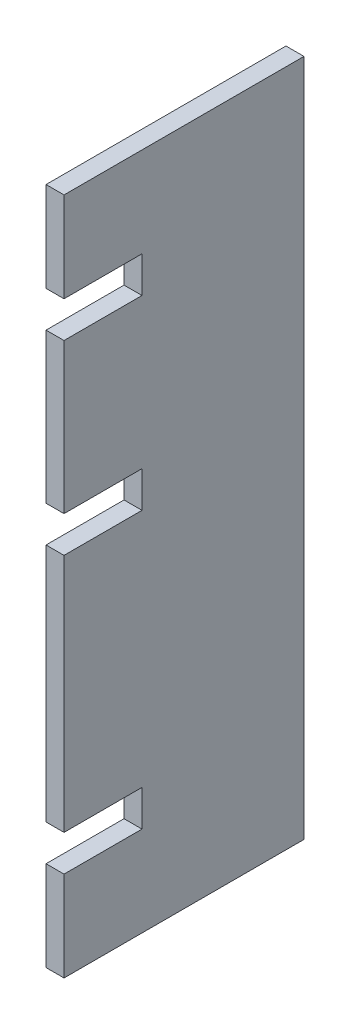
ISO-10303-21;
HEADER;
FILE_DESCRIPTION(('STEP AP214'),'2;1');
FILE_NAME('part.step','',(''),(''),'','','');
FILE_SCHEMA(('AUTOMOTIVE_DESIGN { 1 0 10303 214 1 1 1 1 }'));
ENDSEC;
DATA;
#1=APPLICATION_CONTEXT('core data for automotive mechanical design processes');
#2=APPLICATION_PROTOCOL_DEFINITION('international standard','automotive_design',2000,#1);
#3=PRODUCT_CONTEXT('',#1,'mechanical');
#4=PRODUCT('Part','Part','',(#3));
#5=PRODUCT_RELATED_PRODUCT_CATEGORY('part','',(#4));
#6=PRODUCT_DEFINITION_FORMATION('','',#4);
#7=PRODUCT_DEFINITION_CONTEXT('part definition',#1,'design');
#8=PRODUCT_DEFINITION('design','',#6,#7);
#9=PRODUCT_DEFINITION_SHAPE('','',#8);
#10=(LENGTH_UNIT() NAMED_UNIT(*) SI_UNIT(.MILLI.,.METRE.));
#11=(NAMED_UNIT(*) PLANE_ANGLE_UNIT() SI_UNIT($,.RADIAN.));
#12=(NAMED_UNIT(*) SI_UNIT($,.STERADIAN.) SOLID_ANGLE_UNIT());
#13=UNCERTAINTY_MEASURE_WITH_UNIT(LENGTH_MEASURE(1.E-05),#10,'distance_accuracy_value','');
#14=(GEOMETRIC_REPRESENTATION_CONTEXT(3) GLOBAL_UNCERTAINTY_ASSIGNED_CONTEXT((#13)) GLOBAL_UNIT_ASSIGNED_CONTEXT((#10,
#11,#12)) REPRESENTATION_CONTEXT('',''));
#15=CARTESIAN_POINT('',(0.,0.,0.));
#16=DIRECTION('',(0.,0.,1.));
#17=DIRECTION('',(1.,0.,0.));
#18=AXIS2_PLACEMENT_3D('',#15,#16,#17);
#19=CARTESIAN_POINT('',(6.,0.,0.));
#20=DIRECTION('',(1.,0.,0.));
#21=DIRECTION('',(0.,1.,0.));
#22=AXIS2_PLACEMENT_3D('',#19,#20,#21);
#23=PLANE('',#22);
#24=DIRECTION('',(0.,1.,0.));
#25=VECTOR('',#24,1.);
#26=CARTESIAN_POINT('',(6.,113.06,0.));
#27=LINE('',#26,#25);
#28=CARTESIAN_POINT('',(6.,0.,0.));
#29=VERTEX_POINT('',#28);
#30=CARTESIAN_POINT('',(6.,226.12,0.));
#31=VERTEX_POINT('',#30);
#32=EDGE_CURVE('E263',#29,#31,#27,.T.);
#33=ORIENTED_EDGE('',*,*,#32,.T.);
#34=DIRECTION('',(0.,0.,1.));
#35=VECTOR('',#34,1.);
#36=CARTESIAN_POINT('',(6.,226.12,40.));
#37=LINE('',#36,#35);
#38=CARTESIAN_POINT('',(6.,226.12,80.));
#39=VERTEX_POINT('',#38);
#40=EDGE_CURVE('E221',#31,#39,#37,.T.);
#41=ORIENTED_EDGE('',*,*,#40,.T.);
#42=DIRECTION('',(0.,-1.,0.));
#43=VECTOR('',#42,1.);
#44=CARTESIAN_POINT('',(6.,211.12,80.));
#45=LINE('',#44,#43);
#46=CARTESIAN_POINT('',(6.,196.12,80.));
#47=VERTEX_POINT('',#46);
#48=EDGE_CURVE('E191',#39,#47,#45,.T.);
#49=ORIENTED_EDGE('',*,*,#48,.T.);
#50=DIRECTION('',(0.,0.,-1.));
#51=VECTOR('',#50,1.);
#52=CARTESIAN_POINT('',(6.,196.12,67.));
#53=LINE('',#52,#51);
#54=CARTESIAN_POINT('',(6.,196.12,54.));
#55=VERTEX_POINT('',#54);
#56=EDGE_CURVE('E252',#47,#55,#53,.T.);
#57=ORIENTED_EDGE('',*,*,#56,.T.);
#58=DIRECTION('',(0.,-1.,0.));
#59=VECTOR('',#58,1.);
#60=CARTESIAN_POINT('',(6.,190.1,54.));
#61=LINE('',#60,#59);
#62=CARTESIAN_POINT('',(6.,184.08,54.));
#63=VERTEX_POINT('',#62);
#64=EDGE_CURVE('E187',#55,#63,#61,.T.);
#65=ORIENTED_EDGE('',*,*,#64,.T.);
#66=DIRECTION('',(0.,0.,1.));
#67=VECTOR('',#66,1.);
#68=CARTESIAN_POINT('',(6.,184.08,67.));
#69=LINE('',#68,#67);
#70=CARTESIAN_POINT('',(6.,184.08,80.));
#71=VERTEX_POINT('',#70);
#72=EDGE_CURVE('E228',#63,#71,#69,.T.);
#73=ORIENTED_EDGE('',*,*,#72,.T.);
#74=DIRECTION('',(0.,-1.,0.));
#75=VECTOR('',#74,1.);
#76=CARTESIAN_POINT('',(6.,159.08,80.));
#77=LINE('',#76,#75);
#78=CARTESIAN_POINT('',(6.,134.08,80.));
#79=VERTEX_POINT('',#78);
#80=EDGE_CURVE('E537',#71,#79,#77,.T.);
#81=ORIENTED_EDGE('',*,*,#80,.T.);
#82=DIRECTION('',(0.,0.,-1.));
#83=VECTOR('',#82,1.);
#84=CARTESIAN_POINT('',(6.,134.08,67.));
#85=LINE('',#84,#83);
#86=CARTESIAN_POINT('',(6.,134.08,54.));
#87=VERTEX_POINT('',#86);
#88=EDGE_CURVE('E268',#79,#87,#85,.T.);
#89=ORIENTED_EDGE('',*,*,#88,.T.);
#90=DIRECTION('',(0.,-1.,0.));
#91=VECTOR('',#90,1.);
#92=CARTESIAN_POINT('',(6.,128.06,54.));
#93=LINE('',#92,#91);
#94=CARTESIAN_POINT('',(6.,122.04,54.));
#95=VERTEX_POINT('',#94);
#96=EDGE_CURVE('E181',#87,#95,#93,.T.);
#97=ORIENTED_EDGE('',*,*,#96,.T.);
#98=DIRECTION('',(0.,0.,1.));
#99=VECTOR('',#98,1.);
#100=CARTESIAN_POINT('',(6.,122.04,67.));
#101=LINE('',#100,#99);
#102=CARTESIAN_POINT('',(6.,122.04,80.));
#103=VERTEX_POINT('',#102);
#104=EDGE_CURVE('E206',#95,#103,#101,.T.);
#105=ORIENTED_EDGE('',*,*,#104,.T.);
#106=DIRECTION('',(0.,-1.,0.));
#107=VECTOR('',#106,1.);
#108=CARTESIAN_POINT('',(6.,82.04,80.));
#109=LINE('',#108,#107);
#110=CARTESIAN_POINT('',(6.,42.04,80.));
#111=VERTEX_POINT('',#110);
#112=EDGE_CURVE('E153',#103,#111,#109,.T.);
#113=ORIENTED_EDGE('',*,*,#112,.T.);
#114=DIRECTION('',(0.,0.,-1.));
#115=VECTOR('',#114,1.);
#116=CARTESIAN_POINT('',(6.,42.04,67.));
#117=LINE('',#116,#115);
#118=CARTESIAN_POINT('',(6.,42.04,54.));
#119=VERTEX_POINT('',#118);
#120=EDGE_CURVE('E150',#111,#119,#117,.T.);
#121=ORIENTED_EDGE('',*,*,#120,.T.);
#122=DIRECTION('',(0.,-1.,0.));
#123=VECTOR('',#122,1.);
#124=CARTESIAN_POINT('',(6.,36.02,54.));
#125=LINE('',#124,#123);
#126=CARTESIAN_POINT('',(6.,30.,54.));
#127=VERTEX_POINT('',#126);
#128=EDGE_CURVE('E135',#119,#127,#125,.T.);
#129=ORIENTED_EDGE('',*,*,#128,.T.);
#130=DIRECTION('',(0.,0.,1.));
#131=VECTOR('',#130,1.);
#132=CARTESIAN_POINT('',(6.,30.,67.));
#133=LINE('',#132,#131);
#134=CARTESIAN_POINT('',(6.,30.,80.));
#135=VERTEX_POINT('',#134);
#136=EDGE_CURVE('E200',#127,#135,#133,.T.);
#137=ORIENTED_EDGE('',*,*,#136,.T.);
#138=DIRECTION('',(0.,-1.,0.));
#139=VECTOR('',#138,1.);
#140=CARTESIAN_POINT('',(6.,15.,80.));
#141=LINE('',#140,#139);
#142=CARTESIAN_POINT('',(6.,0.,80.));
#143=VERTEX_POINT('',#142);
#144=EDGE_CURVE('E21',#135,#143,#141,.T.);
#145=ORIENTED_EDGE('',*,*,#144,.T.);
#146=DIRECTION('',(0.,0.,-1.));
#147=VECTOR('',#146,1.);
#148=CARTESIAN_POINT('',(6.,0.,40.));
#149=LINE('',#148,#147);
#150=EDGE_CURVE('E11',#143,#29,#149,.T.);
#151=ORIENTED_EDGE('',*,*,#150,.T.);
#152=EDGE_LOOP('',(#33,#41,#49,#57,#65,#73,#81,#89,#97,#105,#113,#121,#129,#137,#145,#151));
#153=FACE_BOUND('',#152,.T.);
#154=ADVANCED_FACE('F17',(#153),#23,.T.);
#155=CARTESIAN_POINT('',(0.,0.,0.));
#156=DIRECTION('',(1.,0.,0.));
#157=DIRECTION('',(0.,1.,0.));
#158=AXIS2_PLACEMENT_3D('',#155,#156,#157);
#159=PLANE('',#158);
#160=DIRECTION('',(0.,0.,-1.));
#161=VECTOR('',#160,1.);
#162=CARTESIAN_POINT('',(0.,0.,40.));
#163=LINE('',#162,#161);
#164=CARTESIAN_POINT('',(0.,0.,80.));
#165=VERTEX_POINT('',#164);
#166=CARTESIAN_POINT('',(0.,0.,0.));
#167=VERTEX_POINT('',#166);
#168=EDGE_CURVE('E27',#165,#167,#163,.T.);
#169=ORIENTED_EDGE('',*,*,#168,.F.);
#170=DIRECTION('',(0.,-1.,0.));
#171=VECTOR('',#170,1.);
#172=CARTESIAN_POINT('',(0.,15.,80.));
#173=LINE('',#172,#171);
#174=CARTESIAN_POINT('',(0.,30.,80.));
#175=VERTEX_POINT('',#174);
#176=EDGE_CURVE('E207',#175,#165,#173,.T.);
#177=ORIENTED_EDGE('',*,*,#176,.F.);
#178=DIRECTION('',(0.,0.,1.));
#179=VECTOR('',#178,1.);
#180=CARTESIAN_POINT('',(0.,30.,67.));
#181=LINE('',#180,#179);
#182=CARTESIAN_POINT('',(0.,30.,54.));
#183=VERTEX_POINT('',#182);
#184=EDGE_CURVE('E147',#183,#175,#181,.T.);
#185=ORIENTED_EDGE('',*,*,#184,.F.);
#186=DIRECTION('',(0.,-1.,0.));
#187=VECTOR('',#186,1.);
#188=CARTESIAN_POINT('',(0.,36.02,54.));
#189=LINE('',#188,#187);
#190=CARTESIAN_POINT('',(0.,42.04,54.));
#191=VERTEX_POINT('',#190);
#192=EDGE_CURVE('E158',#191,#183,#189,.T.);
#193=ORIENTED_EDGE('',*,*,#192,.F.);
#194=DIRECTION('',(0.,0.,-1.));
#195=VECTOR('',#194,1.);
#196=CARTESIAN_POINT('',(0.,42.04,67.));
#197=LINE('',#196,#195);
#198=CARTESIAN_POINT('',(0.,42.04,80.));
#199=VERTEX_POINT('',#198);
#200=EDGE_CURVE('E161',#199,#191,#197,.T.);
#201=ORIENTED_EDGE('',*,*,#200,.F.);
#202=DIRECTION('',(0.,-1.,0.));
#203=VECTOR('',#202,1.);
#204=CARTESIAN_POINT('',(0.,82.04,80.));
#205=LINE('',#204,#203);
#206=CARTESIAN_POINT('',(0.,122.04,80.));
#207=VERTEX_POINT('',#206);
#208=EDGE_CURVE('E201',#207,#199,#205,.T.);
#209=ORIENTED_EDGE('',*,*,#208,.F.);
#210=DIRECTION('',(0.,0.,1.));
#211=VECTOR('',#210,1.);
#212=CARTESIAN_POINT('',(0.,122.04,67.));
#213=LINE('',#212,#211);
#214=CARTESIAN_POINT('',(0.,122.04,54.));
#215=VERTEX_POINT('',#214);
#216=EDGE_CURVE('E256',#215,#207,#213,.T.);
#217=ORIENTED_EDGE('',*,*,#216,.F.);
#218=DIRECTION('',(0.,-1.,0.));
#219=VECTOR('',#218,1.);
#220=CARTESIAN_POINT('',(0.,128.06,54.));
#221=LINE('',#220,#219);
#222=CARTESIAN_POINT('',(0.,134.08,54.));
#223=VERTEX_POINT('',#222);
#224=EDGE_CURVE('E182',#223,#215,#221,.T.);
#225=ORIENTED_EDGE('',*,*,#224,.F.);
#226=DIRECTION('',(0.,0.,-1.));
#227=VECTOR('',#226,1.);
#228=CARTESIAN_POINT('',(0.,134.08,67.));
#229=LINE('',#228,#227);
#230=CARTESIAN_POINT('',(0.,134.08,80.));
#231=VERTEX_POINT('',#230);
#232=EDGE_CURVE('E540',#231,#223,#229,.T.);
#233=ORIENTED_EDGE('',*,*,#232,.F.);
#234=DIRECTION('',(0.,-1.,0.));
#235=VECTOR('',#234,1.);
#236=CARTESIAN_POINT('',(0.,159.08,80.));
#237=LINE('',#236,#235);
#238=CARTESIAN_POINT('',(0.,184.08,80.));
#239=VERTEX_POINT('',#238);
#240=EDGE_CURVE('E232',#239,#231,#237,.T.);
#241=ORIENTED_EDGE('',*,*,#240,.F.);
#242=DIRECTION('',(0.,0.,1.));
#243=VECTOR('',#242,1.);
#244=CARTESIAN_POINT('',(0.,184.08,67.));
#245=LINE('',#244,#243);
#246=CARTESIAN_POINT('',(0.,184.08,54.));
#247=VERTEX_POINT('',#246);
#248=EDGE_CURVE('E223',#247,#239,#245,.T.);
#249=ORIENTED_EDGE('',*,*,#248,.F.);
#250=DIRECTION('',(0.,-1.,0.));
#251=VECTOR('',#250,1.);
#252=CARTESIAN_POINT('',(0.,190.1,54.));
#253=LINE('',#252,#251);
#254=CARTESIAN_POINT('',(0.,196.12,54.));
#255=VERTEX_POINT('',#254);
#256=EDGE_CURVE('E188',#255,#247,#253,.T.);
#257=ORIENTED_EDGE('',*,*,#256,.F.);
#258=DIRECTION('',(0.,0.,-1.));
#259=VECTOR('',#258,1.);
#260=CARTESIAN_POINT('',(0.,196.12,67.));
#261=LINE('',#260,#259);
#262=CARTESIAN_POINT('',(0.,196.12,80.));
#263=VERTEX_POINT('',#262);
#264=EDGE_CURVE('E195',#263,#255,#261,.T.);
#265=ORIENTED_EDGE('',*,*,#264,.F.);
#266=DIRECTION('',(0.,-1.,0.));
#267=VECTOR('',#266,1.);
#268=CARTESIAN_POINT('',(0.,211.12,80.));
#269=LINE('',#268,#267);
#270=CARTESIAN_POINT('',(0.,226.12,80.));
#271=VERTEX_POINT('',#270);
#272=EDGE_CURVE('E236',#271,#263,#269,.T.);
#273=ORIENTED_EDGE('',*,*,#272,.F.);
#274=DIRECTION('',(0.,0.,1.));
#275=VECTOR('',#274,1.);
#276=CARTESIAN_POINT('',(0.,226.12,40.));
#277=LINE('',#276,#275);
#278=CARTESIAN_POINT('',(0.,226.12,0.));
#279=VERTEX_POINT('',#278);
#280=EDGE_CURVE('E222',#279,#271,#277,.T.);
#281=ORIENTED_EDGE('',*,*,#280,.F.);
#282=DIRECTION('',(0.,1.,0.));
#283=VECTOR('',#282,1.);
#284=CARTESIAN_POINT('',(0.,113.06,0.));
#285=LINE('',#284,#283);
#286=EDGE_CURVE('E237',#167,#279,#285,.T.);
#287=ORIENTED_EDGE('',*,*,#286,.F.);
#288=EDGE_LOOP('',(#169,#177,#185,#193,#201,#209,#217,#225,#233,#241,#249,#257,#265,#273,#281,#287));
#289=FACE_BOUND('',#288,.T.);
#290=ADVANCED_FACE('F349',(#289),#159,.F.);
#291=CARTESIAN_POINT('',(0.,0.,0.));
#292=DIRECTION('',(0.,1.,0.));
#293=DIRECTION('',(1.,0.,0.));
#294=AXIS2_PLACEMENT_3D('',#291,#292,#293);
#295=PLANE('',#294);
#296=DIRECTION('',(1.,0.,0.));
#297=VECTOR('',#296,1.);
#298=CARTESIAN_POINT('',(3.,0.,80.));
#299=LINE('',#298,#297);
#300=EDGE_CURVE('E211',#165,#143,#299,.T.);
#301=ORIENTED_EDGE('',*,*,#300,.F.);
#302=ORIENTED_EDGE('',*,*,#168,.T.);
#303=DIRECTION('',(1.,0.,0.));
#304=VECTOR('',#303,1.);
#305=CARTESIAN_POINT('',(3.,0.,0.));
#306=LINE('',#305,#304);
#307=EDGE_CURVE('E242',#167,#29,#306,.T.);
#308=ORIENTED_EDGE('',*,*,#307,.T.);
#309=ORIENTED_EDGE('',*,*,#150,.F.);
#310=EDGE_LOOP('',(#301,#302,#308,#309));
#311=FACE_BOUND('',#310,.T.);
#312=ADVANCED_FACE('F292',(#311),#295,.F.);
#313=CARTESIAN_POINT('',(0.,196.12,80.));
#314=DIRECTION('',(0.,0.,-1.));
#315=DIRECTION('',(0.,-1.,0.));
#316=AXIS2_PLACEMENT_3D('',#313,#314,#315);
#317=PLANE('',#316);
#318=DIRECTION('',(1.,0.,0.));
#319=VECTOR('',#318,1.);
#320=CARTESIAN_POINT('',(3.,30.,80.));
#321=LINE('',#320,#319);
#322=EDGE_CURVE('E175',#175,#135,#321,.T.);
#323=ORIENTED_EDGE('',*,*,#322,.F.);
#324=ORIENTED_EDGE('',*,*,#176,.T.);
#325=ORIENTED_EDGE('',*,*,#300,.T.);
#326=ORIENTED_EDGE('',*,*,#144,.F.);
#327=EDGE_LOOP('',(#323,#324,#325,#326));
#328=FACE_BOUND('',#327,.T.);
#329=ADVANCED_FACE('F282',(#328),#317,.F.);
#330=CARTESIAN_POINT('',(0.,30.,80.));
#331=DIRECTION('',(0.,-1.,0.));
#332=DIRECTION('',(0.,0.,-1.));
#333=AXIS2_PLACEMENT_3D('',#330,#331,#332);
#334=PLANE('',#333);
#335=DIRECTION('',(1.,0.,0.));
#336=VECTOR('',#335,1.);
#337=CARTESIAN_POINT('',(3.,30.,54.));
#338=LINE('',#337,#336);
#339=EDGE_CURVE('E143',#183,#127,#338,.T.);
#340=ORIENTED_EDGE('',*,*,#339,.F.);
#341=ORIENTED_EDGE('',*,*,#184,.T.);
#342=ORIENTED_EDGE('',*,*,#322,.T.);
#343=ORIENTED_EDGE('',*,*,#136,.F.);
#344=EDGE_LOOP('',(#340,#341,#342,#343));
#345=FACE_BOUND('',#344,.T.);
#346=ADVANCED_FACE('F280',(#345),#334,.F.);
#347=CARTESIAN_POINT('',(0.,184.08,54.));
#348=DIRECTION('',(0.,0.,-1.));
#349=DIRECTION('',(0.,-1.,0.));
#350=AXIS2_PLACEMENT_3D('',#347,#348,#349);
#351=PLANE('',#350);
#352=DIRECTION('',(1.,0.,0.));
#353=VECTOR('',#352,1.);
#354=CARTESIAN_POINT('',(3.,42.04,54.));
#355=LINE('',#354,#353);
#356=EDGE_CURVE('E140',#191,#119,#355,.T.);
#357=ORIENTED_EDGE('',*,*,#356,.F.);
#358=ORIENTED_EDGE('',*,*,#192,.T.);
#359=ORIENTED_EDGE('',*,*,#339,.T.);
#360=ORIENTED_EDGE('',*,*,#128,.F.);
#361=EDGE_LOOP('',(#357,#358,#359,#360));
#362=FACE_BOUND('',#361,.T.);
#363=ADVANCED_FACE('F137',(#362),#351,.F.);
#364=CARTESIAN_POINT('',(0.,42.04,54.));
#365=DIRECTION('',(0.,1.,0.));
#366=DIRECTION('',(1.,0.,0.));
#367=AXIS2_PLACEMENT_3D('',#364,#365,#366);
#368=PLANE('',#367);
#369=DIRECTION('',(1.,0.,0.));
#370=VECTOR('',#369,1.);
#371=CARTESIAN_POINT('',(3.,42.04,80.));
#372=LINE('',#371,#370);
#373=EDGE_CURVE('E205',#199,#111,#372,.T.);
#374=ORIENTED_EDGE('',*,*,#373,.F.);
#375=ORIENTED_EDGE('',*,*,#200,.T.);
#376=ORIENTED_EDGE('',*,*,#356,.T.);
#377=ORIENTED_EDGE('',*,*,#120,.F.);
#378=EDGE_LOOP('',(#374,#375,#376,#377));
#379=FACE_BOUND('',#378,.T.);
#380=ADVANCED_FACE('F19',(#379),#368,.F.);
#381=CARTESIAN_POINT('',(0.,196.12,80.));
#382=DIRECTION('',(0.,0.,-1.));
#383=DIRECTION('',(0.,-1.,0.));
#384=AXIS2_PLACEMENT_3D('',#381,#382,#383);
#385=PLANE('',#384);
#386=DIRECTION('',(1.,0.,0.));
#387=VECTOR('',#386,1.);
#388=CARTESIAN_POINT('',(3.,122.04,80.));
#389=LINE('',#388,#387);
#390=EDGE_CURVE('E574',#207,#103,#389,.T.);
#391=ORIENTED_EDGE('',*,*,#390,.F.);
#392=ORIENTED_EDGE('',*,*,#208,.T.);
#393=ORIENTED_EDGE('',*,*,#373,.T.);
#394=ORIENTED_EDGE('',*,*,#112,.F.);
#395=EDGE_LOOP('',(#391,#392,#393,#394));
#396=FACE_BOUND('',#395,.T.);
#397=ADVANCED_FACE('F424',(#396),#385,.F.);
#398=CARTESIAN_POINT('',(0.,122.04,80.));
#399=DIRECTION('',(0.,-1.,0.));
#400=DIRECTION('',(0.,0.,-1.));
#401=AXIS2_PLACEMENT_3D('',#398,#399,#400);
#402=PLANE('',#401);
#403=DIRECTION('',(1.,0.,0.));
#404=VECTOR('',#403,1.);
#405=CARTESIAN_POINT('',(3.,122.04,54.));
#406=LINE('',#405,#404);
#407=EDGE_CURVE('E177',#215,#95,#406,.T.);
#408=ORIENTED_EDGE('',*,*,#407,.F.);
#409=ORIENTED_EDGE('',*,*,#216,.T.);
#410=ORIENTED_EDGE('',*,*,#390,.T.);
#411=ORIENTED_EDGE('',*,*,#104,.F.);
#412=EDGE_LOOP('',(#408,#409,#410,#411));
#413=FACE_BOUND('',#412,.T.);
#414=ADVANCED_FACE('F415',(#413),#402,.F.);
#415=CARTESIAN_POINT('',(0.,184.08,54.));
#416=DIRECTION('',(0.,0.,-1.));
#417=DIRECTION('',(0.,-1.,0.));
#418=AXIS2_PLACEMENT_3D('',#415,#416,#417);
#419=PLANE('',#418);
#420=DIRECTION('',(1.,0.,0.));
#421=VECTOR('',#420,1.);
#422=CARTESIAN_POINT('',(3.,134.08,54.));
#423=LINE('',#422,#421);
#424=EDGE_CURVE('E272',#223,#87,#423,.T.);
#425=ORIENTED_EDGE('',*,*,#424,.F.);
#426=ORIENTED_EDGE('',*,*,#224,.T.);
#427=ORIENTED_EDGE('',*,*,#407,.T.);
#428=ORIENTED_EDGE('',*,*,#96,.F.);
#429=EDGE_LOOP('',(#425,#426,#427,#428));
#430=FACE_BOUND('',#429,.T.);
#431=ADVANCED_FACE('F383',(#430),#419,.F.);
#432=CARTESIAN_POINT('',(0.,134.08,54.));
#433=DIRECTION('',(0.,1.,0.));
#434=DIRECTION('',(1.,0.,0.));
#435=AXIS2_PLACEMENT_3D('',#432,#433,#434);
#436=PLANE('',#435);
#437=DIRECTION('',(1.,0.,0.));
#438=VECTOR('',#437,1.);
#439=CARTESIAN_POINT('',(3.,134.08,80.));
#440=LINE('',#439,#438);
#441=EDGE_CURVE('E267',#231,#79,#440,.T.);
#442=ORIENTED_EDGE('',*,*,#441,.F.);
#443=ORIENTED_EDGE('',*,*,#232,.T.);
#444=ORIENTED_EDGE('',*,*,#424,.T.);
#445=ORIENTED_EDGE('',*,*,#88,.F.);
#446=EDGE_LOOP('',(#442,#443,#444,#445));
#447=FACE_BOUND('',#446,.T.);
#448=ADVANCED_FACE('F377',(#447),#436,.F.);
#449=CARTESIAN_POINT('',(0.,196.12,80.));
#450=DIRECTION('',(0.,0.,-1.));
#451=DIRECTION('',(0.,-1.,0.));
#452=AXIS2_PLACEMENT_3D('',#449,#450,#451);
#453=PLANE('',#452);
#454=DIRECTION('',(1.,0.,0.));
#455=VECTOR('',#454,1.);
#456=CARTESIAN_POINT('',(3.,184.08,80.));
#457=LINE('',#456,#455);
#458=EDGE_CURVE('E227',#239,#71,#457,.T.);
#459=ORIENTED_EDGE('',*,*,#458,.F.);
#460=ORIENTED_EDGE('',*,*,#240,.T.);
#461=ORIENTED_EDGE('',*,*,#441,.T.);
#462=ORIENTED_EDGE('',*,*,#80,.F.);
#463=EDGE_LOOP('',(#459,#460,#461,#462));
#464=FACE_BOUND('',#463,.T.);
#465=ADVANCED_FACE('F382',(#464),#453,.F.);
#466=CARTESIAN_POINT('',(0.,184.08,80.));
#467=DIRECTION('',(0.,-1.,0.));
#468=DIRECTION('',(0.,0.,-1.));
#469=AXIS2_PLACEMENT_3D('',#466,#467,#468);
#470=PLANE('',#469);
#471=DIRECTION('',(1.,0.,0.));
#472=VECTOR('',#471,1.);
#473=CARTESIAN_POINT('',(3.,184.08,54.));
#474=LINE('',#473,#472);
#475=EDGE_CURVE('E183',#247,#63,#474,.T.);
#476=ORIENTED_EDGE('',*,*,#475,.F.);
#477=ORIENTED_EDGE('',*,*,#248,.T.);
#478=ORIENTED_EDGE('',*,*,#458,.T.);
#479=ORIENTED_EDGE('',*,*,#72,.F.);
#480=EDGE_LOOP('',(#476,#477,#478,#479));
#481=FACE_BOUND('',#480,.T.);
#482=ADVANCED_FACE('F309',(#481),#470,.F.);
#483=CARTESIAN_POINT('',(0.,184.08,54.));
#484=DIRECTION('',(0.,0.,-1.));
#485=DIRECTION('',(0.,-1.,0.));
#486=AXIS2_PLACEMENT_3D('',#483,#484,#485);
#487=PLANE('',#486);
#488=DIRECTION('',(1.,0.,0.));
#489=VECTOR('',#488,1.);
#490=CARTESIAN_POINT('',(3.,196.12,54.));
#491=LINE('',#490,#489);
#492=EDGE_CURVE('E248',#255,#55,#491,.T.);
#493=ORIENTED_EDGE('',*,*,#492,.F.);
#494=ORIENTED_EDGE('',*,*,#256,.T.);
#495=ORIENTED_EDGE('',*,*,#475,.T.);
#496=ORIENTED_EDGE('',*,*,#64,.F.);
#497=EDGE_LOOP('',(#493,#494,#495,#496));
#498=FACE_BOUND('',#497,.T.);
#499=ADVANCED_FACE('F303',(#498),#487,.F.);
#500=CARTESIAN_POINT('',(0.,196.12,54.));
#501=DIRECTION('',(0.,1.,0.));
#502=DIRECTION('',(1.,0.,0.));
#503=AXIS2_PLACEMENT_3D('',#500,#501,#502);
#504=PLANE('',#503);
#505=DIRECTION('',(1.,0.,0.));
#506=VECTOR('',#505,1.);
#507=CARTESIAN_POINT('',(3.,196.12,80.));
#508=LINE('',#507,#506);
#509=EDGE_CURVE('E196',#263,#47,#508,.T.);
#510=ORIENTED_EDGE('',*,*,#509,.F.);
#511=ORIENTED_EDGE('',*,*,#264,.T.);
#512=ORIENTED_EDGE('',*,*,#492,.T.);
#513=ORIENTED_EDGE('',*,*,#56,.F.);
#514=EDGE_LOOP('',(#510,#511,#512,#513));
#515=FACE_BOUND('',#514,.T.);
#516=ADVANCED_FACE('F308',(#515),#504,.F.);
#517=CARTESIAN_POINT('',(0.,196.12,80.));
#518=DIRECTION('',(0.,0.,-1.));
#519=DIRECTION('',(0.,-1.,0.));
#520=AXIS2_PLACEMENT_3D('',#517,#518,#519);
#521=PLANE('',#520);
#522=DIRECTION('',(1.,0.,0.));
#523=VECTOR('',#522,1.);
#524=CARTESIAN_POINT('',(3.,226.12,80.));
#525=LINE('',#524,#523);
#526=EDGE_CURVE('E217',#271,#39,#525,.T.);
#527=ORIENTED_EDGE('',*,*,#526,.F.);
#528=ORIENTED_EDGE('',*,*,#272,.T.);
#529=ORIENTED_EDGE('',*,*,#509,.T.);
#530=ORIENTED_EDGE('',*,*,#48,.F.);
#531=EDGE_LOOP('',(#527,#528,#529,#530));
#532=FACE_BOUND('',#531,.T.);
#533=ADVANCED_FACE('F325',(#532),#521,.F.);
#534=CARTESIAN_POINT('',(0.,226.12,80.));
#535=DIRECTION('',(0.,-1.,0.));
#536=DIRECTION('',(0.,0.,-1.));
#537=AXIS2_PLACEMENT_3D('',#534,#535,#536);
#538=PLANE('',#537);
#539=DIRECTION('',(1.,0.,0.));
#540=VECTOR('',#539,1.);
#541=CARTESIAN_POINT('',(3.,226.12,0.));
#542=LINE('',#541,#540);
#543=EDGE_CURVE('E241',#279,#31,#542,.T.);
#544=ORIENTED_EDGE('',*,*,#543,.F.);
#545=ORIENTED_EDGE('',*,*,#280,.T.);
#546=ORIENTED_EDGE('',*,*,#526,.T.);
#547=ORIENTED_EDGE('',*,*,#40,.F.);
#548=EDGE_LOOP('',(#544,#545,#546,#547));
#549=FACE_BOUND('',#548,.T.);
#550=ADVANCED_FACE('F319',(#549),#538,.F.);
#551=CARTESIAN_POINT('',(0.,0.,0.));
#552=DIRECTION('',(0.,0.,-1.));
#553=DIRECTION('',(0.,-1.,0.));
#554=AXIS2_PLACEMENT_3D('',#551,#552,#553);
#555=PLANE('',#554);
#556=ORIENTED_EDGE('',*,*,#307,.F.);
#557=ORIENTED_EDGE('',*,*,#286,.T.);
#558=ORIENTED_EDGE('',*,*,#543,.T.);
#559=ORIENTED_EDGE('',*,*,#32,.F.);
#560=EDGE_LOOP('',(#556,#557,#558,#559));
#561=FACE_BOUND('',#560,.T.);
#562=ADVANCED_FACE('F324',(#561),#555,.T.);
#563=CLOSED_SHELL('',(#154,#290,#312,#329,#346,#363,#380,#397,#414,#431,#448,#465,#482,#499,
#516,#533,#550,#562));
#564=MANIFOLD_SOLID_BREP('B1',#563);
#565=ADVANCED_BREP_SHAPE_REPRESENTATION('',(#18,#564),#14);
#566=SHAPE_DEFINITION_REPRESENTATION(#9,#565);
ENDSEC;
END-ISO-10303-21;
